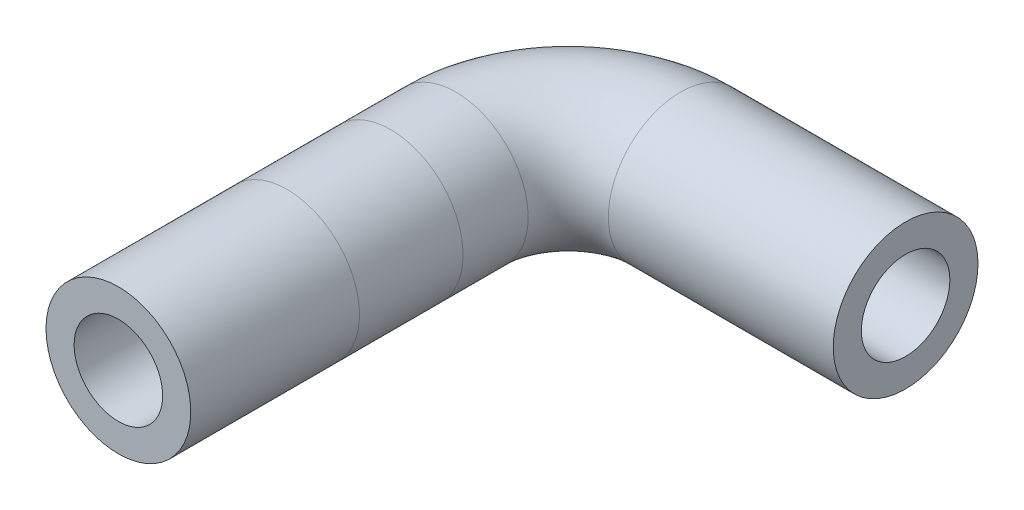
ISO-10303-21;
HEADER;
FILE_DESCRIPTION(('STEP AP214'),'2;1');
FILE_NAME('part.step','',(''),(''),'','','');
FILE_SCHEMA(('AUTOMOTIVE_DESIGN { 1 0 10303 214 1 1 1 1 }'));
ENDSEC;
DATA;
#1=APPLICATION_CONTEXT('core data for automotive mechanical design processes');
#2=APPLICATION_PROTOCOL_DEFINITION('international standard','automotive_design',2000,#1);
#3=PRODUCT_CONTEXT('',#1,'mechanical');
#4=PRODUCT('Part','Part','',(#3));
#5=PRODUCT_RELATED_PRODUCT_CATEGORY('part','',(#4));
#6=PRODUCT_DEFINITION_FORMATION('','',#4);
#7=PRODUCT_DEFINITION_CONTEXT('part definition',#1,'design');
#8=PRODUCT_DEFINITION('design','',#6,#7);
#9=PRODUCT_DEFINITION_SHAPE('','',#8);
#10=(LENGTH_UNIT() NAMED_UNIT(*) SI_UNIT(.MILLI.,.METRE.));
#11=(NAMED_UNIT(*) PLANE_ANGLE_UNIT() SI_UNIT($,.RADIAN.));
#12=(NAMED_UNIT(*) SI_UNIT($,.STERADIAN.) SOLID_ANGLE_UNIT());
#13=UNCERTAINTY_MEASURE_WITH_UNIT(LENGTH_MEASURE(1.E-05),#10,'distance_accuracy_value','');
#14=(GEOMETRIC_REPRESENTATION_CONTEXT(3) GLOBAL_UNCERTAINTY_ASSIGNED_CONTEXT((#13)) GLOBAL_UNIT_ASSIGNED_CONTEXT((#10,
#11,#12)) REPRESENTATION_CONTEXT('',''));
#15=CARTESIAN_POINT('',(0.,0.,0.));
#16=DIRECTION('',(0.,0.,1.));
#17=DIRECTION('',(1.,0.,0.));
#18=AXIS2_PLACEMENT_3D('',#15,#16,#17);
#19=CARTESIAN_POINT('',(-39.4506366392634,4.41546785233906E-13,30.7500469580002));
#20=DIRECTION('',(0.,0.,-1.));
#21=DIRECTION('',(-1.,0.,0.));
#22=AXIS2_PLACEMENT_3D('',#19,#20,#21);
#23=PLANE('',#22);
#24=CARTESIAN_POINT('',(-39.4506366392634,4.41546785233906E-13,30.7500469580002));
#25=DIRECTION('',(0.,0.,-1.));
#26=DIRECTION('',(-1.,0.,0.));
#27=AXIS2_PLACEMENT_3D('',#24,#25,#26);
#28=CIRCLE('',#27,5.);
#29=CARTESIAN_POINT('',(-44.4506366392634,4.41546785233906E-13,30.7500469580002));
#30=VERTEX_POINT('',#29);
#31=EDGE_CURVE('E88',#30,#30,#28,.F.);
#32=ORIENTED_EDGE('',*,*,#31,.F.);
#33=EDGE_LOOP('',(#32));
#34=FACE_BOUND('',#33,.T.);
#35=CARTESIAN_POINT('',(-39.4506366392634,4.41546785233906E-13,30.7500469580002));
#36=DIRECTION('',(0.,0.,-1.));
#37=DIRECTION('',(-1.,0.,0.));
#38=AXIS2_PLACEMENT_3D('',#35,#36,#37);
#39=CIRCLE('',#38,8.175);
#40=CARTESIAN_POINT('',(-47.6256366392634,4.41546785233906E-13,30.7500469580002));
#41=VERTEX_POINT('',#40);
#42=EDGE_CURVE('E85',#41,#41,#39,.T.);
#43=ORIENTED_EDGE('',*,*,#42,.F.);
#44=EDGE_LOOP('',(#43));
#45=FACE_BOUND('',#44,.T.);
#46=ADVANCED_FACE('F63',(#34,#45),#23,.F.);
#47=CARTESIAN_POINT('',(-1.35063663926334,4.40769134516448E-13,-20.0499530419998));
#48=DIRECTION('',(1.,0.,0.));
#49=DIRECTION('',(0.,0.,-1.));
#50=AXIS2_PLACEMENT_3D('',#47,#48,#49);
#51=PLANE('',#50);
#52=CARTESIAN_POINT('',(-1.35063663926334,4.41157959875177E-13,-20.0499530419998));
#53=DIRECTION('',(1.,0.,0.));
#54=DIRECTION('',(0.,0.,-1.));
#55=AXIS2_PLACEMENT_3D('',#52,#53,#54);
#56=CIRCLE('',#55,5.);
#57=CARTESIAN_POINT('',(-1.35063663926334,4.41157959875177E-13,-25.0499530419998));
#58=VERTEX_POINT('',#57);
#59=EDGE_CURVE('E89',#58,#58,#56,.F.);
#60=ORIENTED_EDGE('',*,*,#59,.T.);
#61=EDGE_LOOP('',(#60));
#62=FACE_BOUND('',#61,.T.);
#63=CARTESIAN_POINT('',(-1.35063663926334,4.40769134516448E-13,-20.0499530419998));
#64=DIRECTION('',(1.,0.,0.));
#65=DIRECTION('',(0.,0.,-1.));
#66=AXIS2_PLACEMENT_3D('',#63,#64,#65);
#67=CIRCLE('',#66,8.175);
#68=CARTESIAN_POINT('',(-1.35063663926334,4.40769134516448E-13,-28.2249530419998));
#69=VERTEX_POINT('',#68);
#70=EDGE_CURVE('E11',#69,#69,#67,.T.);
#71=ORIENTED_EDGE('',*,*,#70,.T.);
#72=EDGE_LOOP('',(#71));
#73=FACE_BOUND('',#72,.T.);
#74=ADVANCED_FACE('F112',(#62,#73),#51,.T.);
#75=CARTESIAN_POINT('',(-39.4506366392634,4.41546785233906E-13,30.7500469580002));
#76=DIRECTION('',(0.,0.,-1.));
#77=DIRECTION('',(-1.,0.,0.));
#78=AXIS2_PLACEMENT_3D('',#75,#76,#77);
#79=CYLINDRICAL_SURFACE('',#78,8.175);
#80=CARTESIAN_POINT('',(-39.4506366392634,4.32029398355307E-13,11.7000469580002));
#81=DIRECTION('',(0.,0.,-1.));
#82=DIRECTION('',(-1.,0.,0.));
#83=AXIS2_PLACEMENT_3D('',#80,#81,#82);
#84=CIRCLE('',#83,8.175);
#85=CARTESIAN_POINT('',(-47.6256366392634,4.32029398355307E-13,11.7000469580002));
#86=VERTEX_POINT('',#85);
#87=EDGE_CURVE('E82',#86,#86,#84,.T.);
#88=ORIENTED_EDGE('',*,*,#87,.F.);
#89=EDGE_LOOP('',(#88));
#90=FACE_BOUND('',#89,.T.);
#91=ORIENTED_EDGE('',*,*,#42,.T.);
#92=EDGE_LOOP('',(#91));
#93=FACE_BOUND('',#92,.T.);
#94=ADVANCED_FACE('F116',(#90,#93),#79,.T.);
#95=CARTESIAN_POINT('',(-39.4506366392633,4.72405715726183E-13,11.7000469580003));
#96=DIRECTION('',(0.,0.,-1.));
#97=DIRECTION('',(-1.,0.,0.));
#98=AXIS2_PLACEMENT_3D('',#95,#96,#97);
#99=CYLINDRICAL_SURFACE('',#98,8.175);
#100=CARTESIAN_POINT('',(-39.4506366392633,4.81923102604782E-13,-3.04270497686332E-12));
#101=DIRECTION('',(0.,0.,-1.));
#102=DIRECTION('',(-1.,0.,0.));
#103=AXIS2_PLACEMENT_3D('',#100,#101,#102);
#104=CIRCLE('',#103,8.175);
#105=CARTESIAN_POINT('',(-47.6256366392633,4.81923102604782E-13,-3.03330166850618E-12));
#106=VERTEX_POINT('',#105);
#107=EDGE_CURVE('E77',#106,#106,#104,.T.);
#108=ORIENTED_EDGE('',*,*,#107,.F.);
#109=EDGE_LOOP('',(#108));
#110=FACE_BOUND('',#109,.T.);
#111=ORIENTED_EDGE('',*,*,#87,.T.);
#112=EDGE_LOOP('',(#111));
#113=FACE_BOUND('',#112,.T.);
#114=ADVANCED_FACE('F118',(#110,#113),#99,.T.);
#115=CARTESIAN_POINT('',(-39.4506366392634,4.56909519797391E-13,-3.08780778723872E-12));
#116=DIRECTION('',(0.,0.,-1.));
#117=DIRECTION('',(-1.,0.,0.));
#118=AXIS2_PLACEMENT_3D('',#115,#116,#117);
#119=CYLINDRICAL_SURFACE('',#118,8.175);
#120=CARTESIAN_POINT('',(-39.4506366392634,4.56909519797391E-13,-7.34995304199977));
#121=DIRECTION('',(0.,0.,-1.));
#122=DIRECTION('',(-1.,0.,0.));
#123=AXIS2_PLACEMENT_3D('',#120,#121,#122);
#124=CIRCLE('',#123,8.175);
#125=CARTESIAN_POINT('',(-47.6256366392634,4.56909519797391E-13,-7.34995304199975));
#126=VERTEX_POINT('',#125);
#127=EDGE_CURVE('E73',#126,#126,#124,.T.);
#128=ORIENTED_EDGE('',*,*,#127,.F.);
#129=EDGE_LOOP('',(#128));
#130=FACE_BOUND('',#129,.T.);
#131=ORIENTED_EDGE('',*,*,#107,.T.);
#132=EDGE_LOOP('',(#131));
#133=FACE_BOUND('',#132,.T.);
#134=ADVANCED_FACE('F125',(#130,#133),#119,.T.);
#135=CARTESIAN_POINT('',(-26.7506366392634,4.56909519797391E-13,-7.3499530419998));
#136=DIRECTION('',(0.,-1.,0.));
#137=DIRECTION('',(0.,0.,-1.));
#138=AXIS2_PLACEMENT_3D('',#135,#136,#137);
#139=TOROIDAL_SURFACE('',#138,12.7,8.175);
#140=CARTESIAN_POINT('',(-26.7506366392634,4.41546785233906E-13,-20.0499530419998));
#141=DIRECTION('',(1.,0.,0.));
#142=DIRECTION('',(0.,0.,-1.));
#143=AXIS2_PLACEMENT_3D('',#140,#141,#142);
#144=CIRCLE('',#143,8.175);
#145=CARTESIAN_POINT('',(-26.7506366392634,4.3165778089875E-13,-28.2249530419998));
#146=VERTEX_POINT('',#145);
#147=EDGE_CURVE('E69',#146,#146,#144,.T.);
#148=CARTESIAN_POINT('',(-26.7506366392634,4.56909519797391E-13,-7.3499530419998));
#149=DIRECTION('',(0.,-1.,0.));
#150=DIRECTION('',(0.,0.,-1.));
#151=AXIS2_PLACEMENT_3D('',#148,#149,#150);
#152=CIRCLE('',#151,20.875);
#153=EDGE_CURVE('',#126,#146,#152,.T.);
#154=ORIENTED_EDGE('',*,*,#127,.T.);
#155=ORIENTED_EDGE('',*,*,#147,.F.);
#156=ORIENTED_EDGE('',*,*,#153,.T.);
#157=ORIENTED_EDGE('',*,*,#153,.F.);
#158=EDGE_LOOP('',(#154,#156,#155,#157));
#159=FACE_BOUND('',#158,.T.);
#160=ADVANCED_FACE('F133',(#159),#139,.T.);
#161=CARTESIAN_POINT('',(-26.7506366392633,4.40769134516448E-13,-20.0499530419998));
#162=DIRECTION('',(1.,0.,0.));
#163=DIRECTION('',(0.,0.,-1.));
#164=AXIS2_PLACEMENT_3D('',#161,#162,#163);
#165=CYLINDRICAL_SURFACE('',#164,8.175);
#166=ORIENTED_EDGE('',*,*,#70,.F.);
#167=EDGE_LOOP('',(#166));
#168=FACE_BOUND('',#167,.T.);
#169=ORIENTED_EDGE('',*,*,#147,.T.);
#170=EDGE_LOOP('',(#169));
#171=FACE_BOUND('',#170,.T.);
#172=ADVANCED_FACE('F131',(#168,#171),#165,.T.);
#173=CARTESIAN_POINT('',(-26.7506366392634,4.41157959875177E-13,-20.0499530419998));
#174=DIRECTION('',(1.,0.,0.));
#175=DIRECTION('',(0.,0.,-1.));
#176=AXIS2_PLACEMENT_3D('',#173,#174,#175);
#177=CYLINDRICAL_SURFACE('',#176,5.);
#178=CARTESIAN_POINT('',(-26.7506366392634,4.41546785233906E-13,-20.0499530419998));
#179=DIRECTION('',(1.,0.,0.));
#180=DIRECTION('',(0.,0.,-1.));
#181=AXIS2_PLACEMENT_3D('',#178,#179,#180);
#182=CIRCLE('',#181,5.);
#183=CARTESIAN_POINT('',(-26.7506366392634,4.35498464539621E-13,-25.0499530419998));
#184=VERTEX_POINT('',#183);
#185=EDGE_CURVE('E93',#184,#184,#182,.T.);
#186=ORIENTED_EDGE('',*,*,#185,.F.);
#187=EDGE_LOOP('',(#186));
#188=FACE_BOUND('',#187,.T.);
#189=ORIENTED_EDGE('',*,*,#59,.F.);
#190=EDGE_LOOP('',(#189));
#191=FACE_BOUND('',#190,.T.);
#192=ADVANCED_FACE('F113',(#188,#191),#177,.F.);
#193=CARTESIAN_POINT('',(-39.4506366392634,4.44044787039313E-13,35.7500469580002));
#194=DIRECTION('',(0.,0.,-1.));
#195=DIRECTION('',(-1.,0.,0.));
#196=AXIS2_PLACEMENT_3D('',#193,#194,#195);
#197=CYLINDRICAL_SURFACE('',#196,5.);
#198=ORIENTED_EDGE('',*,*,#31,.T.);
#199=EDGE_LOOP('',(#198));
#200=FACE_BOUND('',#199,.T.);
#201=CARTESIAN_POINT('',(-39.4506366392634,4.32029398355307E-13,11.7000469580002));
#202=DIRECTION('',(0.,0.,-1.));
#203=DIRECTION('',(-1.,0.,0.));
#204=AXIS2_PLACEMENT_3D('',#201,#202,#203);
#205=CIRCLE('',#204,5.);
#206=CARTESIAN_POINT('',(-44.4506366392634,4.32029398355307E-13,11.7000469580002));
#207=VERTEX_POINT('',#206);
#208=EDGE_CURVE('E92',#207,#207,#205,.T.);
#209=ORIENTED_EDGE('',*,*,#208,.T.);
#210=EDGE_LOOP('',(#209));
#211=FACE_BOUND('',#210,.T.);
#212=ADVANCED_FACE('F107',(#200,#211),#197,.F.);
#213=CARTESIAN_POINT('',(-39.4506366392634,4.72405715726182E-13,11.7000469580003));
#214=DIRECTION('',(0.,0.,-1.));
#215=DIRECTION('',(-1.,0.,0.));
#216=AXIS2_PLACEMENT_3D('',#213,#214,#215);
#217=CYLINDRICAL_SURFACE('',#216,5.);
#218=CARTESIAN_POINT('',(-39.4506366392634,4.81923102604782E-13,-3.07046055247895E-12));
#219=DIRECTION('',(0.,0.,-1.));
#220=DIRECTION('',(-1.,0.,0.));
#221=AXIS2_PLACEMENT_3D('',#218,#219,#220);
#222=CIRCLE('',#221,5.);
#223=CARTESIAN_POINT('',(-44.4506366392634,4.81923102604782E-13,-3.06470929354492E-12));
#224=VERTEX_POINT('',#223);
#225=EDGE_CURVE('E96',#224,#224,#222,.T.);
#226=ORIENTED_EDGE('',*,*,#225,.T.);
#227=EDGE_LOOP('',(#226));
#228=FACE_BOUND('',#227,.T.);
#229=ORIENTED_EDGE('',*,*,#208,.F.);
#230=EDGE_LOOP('',(#229));
#231=FACE_BOUND('',#230,.T.);
#232=ADVANCED_FACE('F192',(#228,#231),#217,.F.);
#233=CARTESIAN_POINT('',(-39.4506366392634,4.56909519797391E-13,-3.11556336285435E-12));
#234=DIRECTION('',(0.,0.,-1.));
#235=DIRECTION('',(-1.,0.,0.));
#236=AXIS2_PLACEMENT_3D('',#233,#234,#235);
#237=CYLINDRICAL_SURFACE('',#236,5.);
#238=CARTESIAN_POINT('',(-39.4506366392634,4.56909519797391E-13,-7.34995304199979));
#239=DIRECTION('',(0.,0.,-1.));
#240=DIRECTION('',(-1.,0.,0.));
#241=AXIS2_PLACEMENT_3D('',#238,#239,#240);
#242=CIRCLE('',#241,5.);
#243=CARTESIAN_POINT('',(-44.4506366392634,4.56909519797391E-13,-7.34995304199979));
#244=VERTEX_POINT('',#243);
#245=EDGE_CURVE('E99',#244,#244,#242,.T.);
#246=ORIENTED_EDGE('',*,*,#245,.T.);
#247=EDGE_LOOP('',(#246));
#248=FACE_BOUND('',#247,.T.);
#249=ORIENTED_EDGE('',*,*,#225,.F.);
#250=EDGE_LOOP('',(#249));
#251=FACE_BOUND('',#250,.T.);
#252=ADVANCED_FACE('F201',(#248,#251),#237,.F.);
#253=CARTESIAN_POINT('',(-26.7506366392634,4.56909519797391E-13,-7.3499530419998));
#254=DIRECTION('',(0.,-1.,0.));
#255=DIRECTION('',(0.,0.,-1.));
#256=AXIS2_PLACEMENT_3D('',#253,#254,#255);
#257=TOROIDAL_SURFACE('',#256,12.7,5.);
#258=CARTESIAN_POINT('',(-26.7506366392634,4.56909519797391E-13,-7.3499530419998));
#259=DIRECTION('',(0.,-1.,0.));
#260=DIRECTION('',(0.,0.,-1.));
#261=AXIS2_PLACEMENT_3D('',#258,#259,#260);
#262=CIRCLE('',#261,17.7);
#263=EDGE_CURVE('',#244,#184,#262,.T.);
#264=ORIENTED_EDGE('',*,*,#245,.F.);
#265=ORIENTED_EDGE('',*,*,#185,.T.);
#266=ORIENTED_EDGE('',*,*,#263,.T.);
#267=ORIENTED_EDGE('',*,*,#263,.F.);
#268=EDGE_LOOP('',(#264,#266,#265,#267));
#269=FACE_BOUND('',#268,.T.);
#270=ADVANCED_FACE('F141',(#269),#257,.F.);
#271=CLOSED_SHELL('',(#46,#74,#94,#114,#134,#160,#172,#192,#212,#232,#252,#270));
#272=MANIFOLD_SOLID_BREP('B2',#271);
#273=ADVANCED_BREP_SHAPE_REPRESENTATION('',(#18,#272),#14);
#274=SHAPE_DEFINITION_REPRESENTATION(#9,#273);
ENDSEC;
END-ISO-10303-21;
